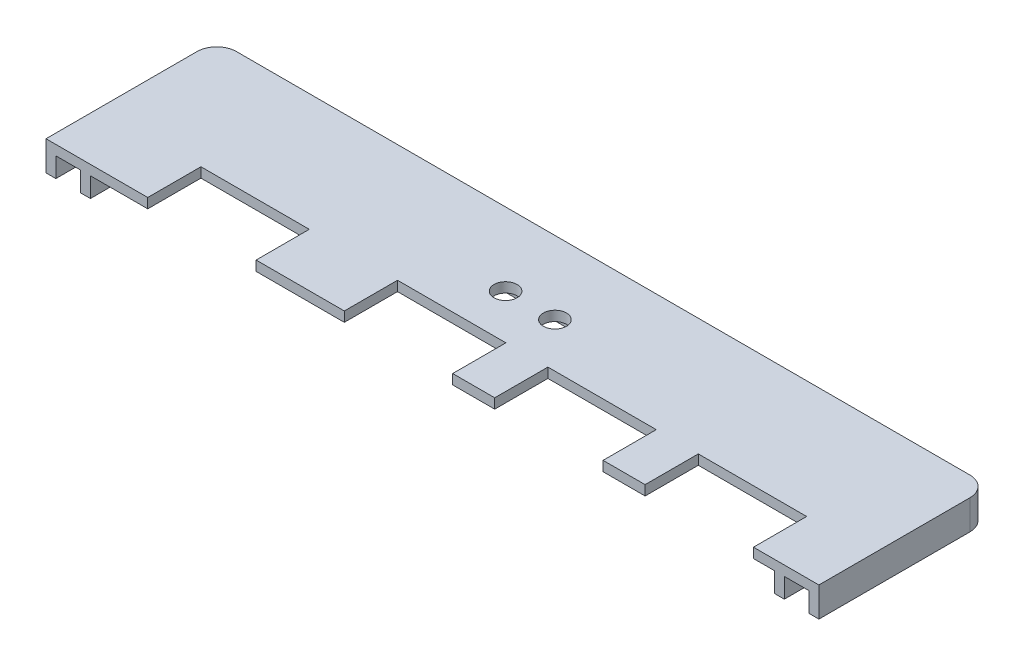
ISO-10303-21;
HEADER;
FILE_DESCRIPTION(('STEP AP214'),'2;1');
FILE_NAME('part.step','',(''),(''),'','','');
FILE_SCHEMA(('AUTOMOTIVE_DESIGN { 1 0 10303 214 1 1 1 1 }'));
ENDSEC;
DATA;
#1=APPLICATION_CONTEXT('core data for automotive mechanical design processes');
#2=APPLICATION_PROTOCOL_DEFINITION('international standard','automotive_design',2000,#1);
#3=PRODUCT_CONTEXT('',#1,'mechanical');
#4=PRODUCT('Part','Part','',(#3));
#5=PRODUCT_RELATED_PRODUCT_CATEGORY('part','',(#4));
#6=PRODUCT_DEFINITION_FORMATION('','',#4);
#7=PRODUCT_DEFINITION_CONTEXT('part definition',#1,'design');
#8=PRODUCT_DEFINITION('design','',#6,#7);
#9=PRODUCT_DEFINITION_SHAPE('','',#8);
#10=(LENGTH_UNIT() NAMED_UNIT(*) SI_UNIT(.MILLI.,.METRE.));
#11=(NAMED_UNIT(*) PLANE_ANGLE_UNIT() SI_UNIT($,.RADIAN.));
#12=(NAMED_UNIT(*) SI_UNIT($,.STERADIAN.) SOLID_ANGLE_UNIT());
#13=UNCERTAINTY_MEASURE_WITH_UNIT(LENGTH_MEASURE(1.E-05),#10,'distance_accuracy_value','');
#14=(GEOMETRIC_REPRESENTATION_CONTEXT(3) GLOBAL_UNCERTAINTY_ASSIGNED_CONTEXT((#13)) GLOBAL_UNIT_ASSIGNED_CONTEXT((#10,
#11,#12)) REPRESENTATION_CONTEXT('',''));
#15=CARTESIAN_POINT('',(0.,0.,0.));
#16=DIRECTION('',(0.,0.,1.));
#17=DIRECTION('',(1.,0.,0.));
#18=AXIS2_PLACEMENT_3D('',#15,#16,#17);
#19=CARTESIAN_POINT('',(0.,1.27,-22.9743000000001));
#20=DIRECTION('',(0.,0.,-1.));
#21=DIRECTION('',(-1.,0.,0.));
#22=AXIS2_PLACEMENT_3D('',#19,#20,#21);
#23=PLANE('',#22);
#24=DIRECTION('',(1.,0.,0.));
#25=VECTOR('',#24,1.);
#26=CARTESIAN_POINT('',(0.,0.,-22.9743000000001));
#27=LINE('',#26,#25);
#28=CARTESIAN_POINT('',(27.3685000000001,0.,-22.9743000000001));
#29=VERTEX_POINT('',#28);
#30=CARTESIAN_POINT('',(41.3131000000001,0.,-22.9743000000002));
#31=VERTEX_POINT('',#30);
#32=EDGE_CURVE('E368',#29,#31,#27,.T.);
#33=ORIENTED_EDGE('',*,*,#32,.T.);
#34=DIRECTION('',(0.,-1.,0.));
#35=VECTOR('',#34,1.);
#36=CARTESIAN_POINT('',(41.3131000000001,1.27,-22.9743000000002));
#37=LINE('',#36,#35);
#38=CARTESIAN_POINT('',(41.3131000000001,1.27,-22.9743000000002));
#39=VERTEX_POINT('',#38);
#40=EDGE_CURVE('E378',#39,#31,#37,.T.);
#41=ORIENTED_EDGE('',*,*,#40,.F.);
#42=DIRECTION('',(1.,0.,0.));
#43=VECTOR('',#42,1.);
#44=CARTESIAN_POINT('',(0.,1.27,-22.9743000000001));
#45=LINE('',#44,#43);
#46=CARTESIAN_POINT('',(27.3685000000001,1.27,-22.9743000000001));
#47=VERTEX_POINT('',#46);
#48=EDGE_CURVE('E334',#47,#39,#45,.T.);
#49=ORIENTED_EDGE('',*,*,#48,.F.);
#50=DIRECTION('',(0.,-1.,0.));
#51=VECTOR('',#50,1.);
#52=CARTESIAN_POINT('',(27.3685000000001,1.27,-22.9743000000001));
#53=LINE('',#52,#51);
#54=EDGE_CURVE('E376',#47,#29,#53,.T.);
#55=ORIENTED_EDGE('',*,*,#54,.T.);
#56=EDGE_LOOP('',(#33,#41,#49,#55));
#57=FACE_BOUND('',#56,.T.);
#58=ADVANCED_FACE('F34',(#57),#23,.F.);
#59=CARTESIAN_POINT('',(0.,1.27,-22.9743000000002));
#60=DIRECTION('',(0.,0.,-1.));
#61=DIRECTION('',(-1.,0.,0.));
#62=AXIS2_PLACEMENT_3D('',#59,#60,#61);
#63=PLANE('',#62);
#64=DIRECTION('',(1.,0.,0.));
#65=VECTOR('',#64,1.);
#66=CARTESIAN_POINT('',(0.,0.,-22.9743000000002));
#67=LINE('',#66,#65);
#68=CARTESIAN_POINT('',(8.0137,0.,-22.9743000000002));
#69=VERTEX_POINT('',#68);
#70=CARTESIAN_POINT('',(21.9583000000001,0.,-22.9743000000001));
#71=VERTEX_POINT('',#70);
#72=EDGE_CURVE('E359',#69,#71,#67,.T.);
#73=ORIENTED_EDGE('',*,*,#72,.T.);
#74=DIRECTION('',(0.,-1.,0.));
#75=VECTOR('',#74,1.);
#76=CARTESIAN_POINT('',(21.9583000000001,1.27,-22.9743000000001));
#77=LINE('',#76,#75);
#78=CARTESIAN_POINT('',(21.9583000000001,1.27,-22.9743000000001));
#79=VERTEX_POINT('',#78);
#80=EDGE_CURVE('E379',#79,#71,#77,.T.);
#81=ORIENTED_EDGE('',*,*,#80,.F.);
#82=DIRECTION('',(1.,0.,0.));
#83=VECTOR('',#82,1.);
#84=CARTESIAN_POINT('',(0.,1.27,-22.9743000000002));
#85=LINE('',#84,#83);
#86=CARTESIAN_POINT('',(8.0137,1.27,-22.9743000000002));
#87=VERTEX_POINT('',#86);
#88=EDGE_CURVE('E325',#87,#79,#85,.T.);
#89=ORIENTED_EDGE('',*,*,#88,.F.);
#90=DIRECTION('',(0.,-1.,0.));
#91=VECTOR('',#90,1.);
#92=CARTESIAN_POINT('',(8.0137,1.27,-22.9743000000002));
#93=LINE('',#92,#91);
#94=EDGE_CURVE('E383',#87,#69,#93,.T.);
#95=ORIENTED_EDGE('',*,*,#94,.T.);
#96=EDGE_LOOP('',(#73,#81,#89,#95));
#97=FACE_BOUND('',#96,.T.);
#98=ADVANCED_FACE('F601',(#97),#63,.F.);
#99=CARTESIAN_POINT('',(0.,1.27,-22.9743000000001));
#100=DIRECTION('',(0.,0.,-1.));
#101=DIRECTION('',(-1.,0.,0.));
#102=AXIS2_PLACEMENT_3D('',#99,#100,#101);
#103=PLANE('',#102);
#104=DIRECTION('',(1.,0.,0.));
#105=VECTOR('',#104,1.);
#106=CARTESIAN_POINT('',(0.,0.,-22.9743000000001));
#107=LINE('',#106,#105);
#108=CARTESIAN_POINT('',(-11.3411,0.,-22.9743000000001));
#109=VERTEX_POINT('',#108);
#110=CARTESIAN_POINT('',(2.60350000000002,0.,-22.9743000000001));
#111=VERTEX_POINT('',#110);
#112=EDGE_CURVE('E350',#109,#111,#107,.T.);
#113=ORIENTED_EDGE('',*,*,#112,.T.);
#114=DIRECTION('',(0.,-1.,0.));
#115=VECTOR('',#114,1.);
#116=CARTESIAN_POINT('',(2.60350000000002,1.27,-22.9743000000001));
#117=LINE('',#116,#115);
#118=CARTESIAN_POINT('',(2.60350000000002,1.27,-22.9743000000001));
#119=VERTEX_POINT('',#118);
#120=EDGE_CURVE('E385',#119,#111,#117,.T.);
#121=ORIENTED_EDGE('',*,*,#120,.F.);
#122=DIRECTION('',(1.,0.,0.));
#123=VECTOR('',#122,1.);
#124=CARTESIAN_POINT('',(0.,1.27,-22.9743000000001));
#125=LINE('',#124,#123);
#126=CARTESIAN_POINT('',(-11.3411,1.27,-22.9743000000001));
#127=VERTEX_POINT('',#126);
#128=EDGE_CURVE('E316',#127,#119,#125,.T.);
#129=ORIENTED_EDGE('',*,*,#128,.F.);
#130=DIRECTION('',(0.,-1.,0.));
#131=VECTOR('',#130,1.);
#132=CARTESIAN_POINT('',(-11.3411,1.27,-22.9743000000001));
#133=LINE('',#132,#131);
#134=EDGE_CURVE('E388',#127,#109,#133,.T.);
#135=ORIENTED_EDGE('',*,*,#134,.T.);
#136=EDGE_LOOP('',(#113,#121,#129,#135));
#137=FACE_BOUND('',#136,.T.);
#138=ADVANCED_FACE('F588',(#137),#103,.F.);
#139=CARTESIAN_POINT('',(0.,1.27,-22.9743000000001));
#140=DIRECTION('',(0.,0.,-1.));
#141=DIRECTION('',(-1.,0.,0.));
#142=AXIS2_PLACEMENT_3D('',#139,#140,#141);
#143=PLANE('',#142);
#144=DIRECTION('',(1.,0.,0.));
#145=VECTOR('',#144,1.);
#146=CARTESIAN_POINT('',(0.,0.,-22.9743000000001));
#147=LINE('',#146,#145);
#148=CARTESIAN_POINT('',(-36.6395,0.,-22.9743000000001));
#149=VERTEX_POINT('',#148);
#150=CARTESIAN_POINT('',(-22.6949,0.,-22.9743000000001));
#151=VERTEX_POINT('',#150);
#152=EDGE_CURVE('E347',#149,#151,#147,.T.);
#153=ORIENTED_EDGE('',*,*,#152,.T.);
#154=DIRECTION('',(0.,-1.,0.));
#155=VECTOR('',#154,1.);
#156=CARTESIAN_POINT('',(-22.6949,1.27,-22.9743000000001));
#157=LINE('',#156,#155);
#158=CARTESIAN_POINT('',(-22.6949,1.27,-22.9743000000001));
#159=VERTEX_POINT('',#158);
#160=EDGE_CURVE('E343',#159,#151,#157,.T.);
#161=ORIENTED_EDGE('',*,*,#160,.F.);
#162=DIRECTION('',(1.,0.,0.));
#163=VECTOR('',#162,1.);
#164=CARTESIAN_POINT('',(0.,1.27,-22.9743000000001));
#165=LINE('',#164,#163);
#166=CARTESIAN_POINT('',(-36.6395,1.27,-22.9743000000001));
#167=VERTEX_POINT('',#166);
#168=EDGE_CURVE('E307',#167,#159,#165,.T.);
#169=ORIENTED_EDGE('',*,*,#168,.F.);
#170=DIRECTION('',(0.,-1.,0.));
#171=VECTOR('',#170,1.);
#172=CARTESIAN_POINT('',(-36.6395,1.27,-22.9743000000001));
#173=LINE('',#172,#171);
#174=EDGE_CURVE('E390',#167,#149,#173,.T.);
#175=ORIENTED_EDGE('',*,*,#174,.T.);
#176=EDGE_LOOP('',(#153,#161,#169,#175));
#177=FACE_BOUND('',#176,.T.);
#178=ADVANCED_FACE('F637',(#177),#143,.F.);
#179=CARTESIAN_POINT('',(47.1932000000001,1.27,-35.56));
#180=DIRECTION('',(0.,1.,0.));
#181=DIRECTION('',(0.,0.,1.));
#182=AXIS2_PLACEMENT_3D('',#179,#180,#181);
#183=CYLINDRICAL_SURFACE('',#182,2.54);
#184=CARTESIAN_POINT('',(47.1932000000001,1.27,-35.56));
#185=DIRECTION('',(0.,1.,0.));
#186=DIRECTION('',(0.,0.,1.));
#187=AXIS2_PLACEMENT_3D('',#184,#185,#186);
#188=CIRCLE('',#187,2.54);
#189=CARTESIAN_POINT('',(49.7332000000001,1.27,-35.56));
#190=VERTEX_POINT('',#189);
#191=CARTESIAN_POINT('',(47.1932000000001,1.27,-38.1));
#192=VERTEX_POINT('',#191);
#193=EDGE_CURVE('E403',#190,#192,#188,.T.);
#194=ORIENTED_EDGE('',*,*,#193,.F.);
#195=DIRECTION('',(0.,-1.,0.));
#196=VECTOR('',#195,1.);
#197=CARTESIAN_POINT('',(49.7332000000001,1.27,-35.56));
#198=LINE('',#197,#196);
#199=CARTESIAN_POINT('',(49.7332000000001,-2.54,-35.56));
#200=VERTEX_POINT('',#199);
#201=EDGE_CURVE('E407',#200,#190,#198,.F.);
#202=ORIENTED_EDGE('',*,*,#201,.F.);
#203=CARTESIAN_POINT('',(47.1932000000001,-2.54,-35.56));
#204=DIRECTION('',(0.,-1.,0.));
#205=DIRECTION('',(0.,0.,-1.));
#206=AXIS2_PLACEMENT_3D('',#203,#204,#205);
#207=CIRCLE('',#206,2.54);
#208=CARTESIAN_POINT('',(47.1932000000001,-2.54,-38.1));
#209=VERTEX_POINT('',#208);
#210=EDGE_CURVE('E280',#209,#200,#207,.T.);
#211=ORIENTED_EDGE('',*,*,#210,.F.);
#212=DIRECTION('',(0.,-1.,0.));
#213=VECTOR('',#212,1.);
#214=CARTESIAN_POINT('',(47.1932000000001,0.,-38.1));
#215=LINE('',#214,#213);
#216=EDGE_CURVE('E399',#192,#209,#215,.T.);
#217=ORIENTED_EDGE('',*,*,#216,.F.);
#218=EDGE_LOOP('',(#194,#202,#211,#217));
#219=FACE_BOUND('',#218,.T.);
#220=ADVANCED_FACE('F36',(#219),#183,.T.);
#221=CARTESIAN_POINT('',(0.,1.27,-38.1));
#222=DIRECTION('',(0.,0.,-1.));
#223=DIRECTION('',(-1.,0.,0.));
#224=AXIS2_PLACEMENT_3D('',#221,#222,#223);
#225=PLANE('',#224);
#226=ORIENTED_EDGE('',*,*,#216,.T.);
#227=DIRECTION('',(1.,0.,0.));
#228=VECTOR('',#227,1.);
#229=CARTESIAN_POINT('',(0.,-2.54,-38.1));
#230=LINE('',#229,#228);
#231=CARTESIAN_POINT('',(-47.1932,-2.54,-38.1));
#232=VERTEX_POINT('',#231);
#233=EDGE_CURVE('E286',#232,#209,#230,.T.);
#234=ORIENTED_EDGE('',*,*,#233,.F.);
#235=DIRECTION('',(0.,-1.,0.));
#236=VECTOR('',#235,1.);
#237=CARTESIAN_POINT('',(-47.1932,1.27,-38.1));
#238=LINE('',#237,#236);
#239=CARTESIAN_POINT('',(-47.1932,1.27,-38.1));
#240=VERTEX_POINT('',#239);
#241=EDGE_CURVE('E401',#232,#240,#238,.F.);
#242=ORIENTED_EDGE('',*,*,#241,.T.);
#243=DIRECTION('',(1.,0.,0.));
#244=VECTOR('',#243,1.);
#245=CARTESIAN_POINT('',(0.,1.27,-38.1));
#246=LINE('',#245,#244);
#247=EDGE_CURVE('E311',#240,#192,#246,.T.);
#248=ORIENTED_EDGE('',*,*,#247,.T.);
#249=EDGE_LOOP('',(#226,#234,#242,#248));
#250=FACE_BOUND('',#249,.T.);
#251=ADVANCED_FACE('F484',(#250),#225,.T.);
#252=CARTESIAN_POINT('',(-47.1932,1.27,-35.56));
#253=DIRECTION('',(0.,-1.,0.));
#254=DIRECTION('',(0.,0.,-1.));
#255=AXIS2_PLACEMENT_3D('',#252,#253,#254);
#256=CYLINDRICAL_SURFACE('',#255,2.54);
#257=CARTESIAN_POINT('',(-47.1932,1.27,-35.56));
#258=DIRECTION('',(0.,1.,0.));
#259=DIRECTION('',(0.,0.,1.));
#260=AXIS2_PLACEMENT_3D('',#257,#258,#259);
#261=CIRCLE('',#260,2.54);
#262=CARTESIAN_POINT('',(-49.7332,1.27,-35.56));
#263=VERTEX_POINT('',#262);
#264=EDGE_CURVE('E405',#240,#263,#261,.T.);
#265=ORIENTED_EDGE('',*,*,#264,.F.);
#266=ORIENTED_EDGE('',*,*,#241,.F.);
#267=CARTESIAN_POINT('',(-47.1932,-2.54,-35.56));
#268=DIRECTION('',(0.,-1.,0.));
#269=DIRECTION('',(0.,0.,-1.));
#270=AXIS2_PLACEMENT_3D('',#267,#268,#269);
#271=CIRCLE('',#270,2.54);
#272=CARTESIAN_POINT('',(-49.7332,-2.54,-35.56));
#273=VERTEX_POINT('',#272);
#274=EDGE_CURVE('E472',#273,#232,#271,.T.);
#275=ORIENTED_EDGE('',*,*,#274,.F.);
#276=DIRECTION('',(0.,-1.,0.));
#277=VECTOR('',#276,1.);
#278=CARTESIAN_POINT('',(-49.7332,1.27,-35.56));
#279=LINE('',#278,#277);
#280=EDGE_CURVE('E382',#263,#273,#279,.T.);
#281=ORIENTED_EDGE('',*,*,#280,.F.);
#282=EDGE_LOOP('',(#265,#266,#275,#281));
#283=FACE_BOUND('',#282,.T.);
#284=ADVANCED_FACE('F486',(#283),#256,.T.);
#285=CARTESIAN_POINT('',(0.,-2.54,-36.83));
#286=DIRECTION('',(0.,0.,-1.));
#287=DIRECTION('',(-1.,0.,0.));
#288=AXIS2_PLACEMENT_3D('',#285,#286,#287);
#289=PLANE('',#288);
#290=DIRECTION('',(-1.,0.,0.));
#291=VECTOR('',#290,1.);
#292=CARTESIAN_POINT('',(0.,0.,-36.83));
#293=LINE('',#292,#291);
#294=CARTESIAN_POINT('',(48.4632,0.,-36.83));
#295=VERTEX_POINT('',#294);
#296=CARTESIAN_POINT('',(-48.4632,0.,-36.83));
#297=VERTEX_POINT('',#296);
#298=EDGE_CURVE('E292',#295,#297,#293,.T.);
#299=ORIENTED_EDGE('',*,*,#298,.T.);
#300=DIRECTION('',(0.,1.,0.));
#301=VECTOR('',#300,1.);
#302=CARTESIAN_POINT('',(-48.4632,-2.54,-36.83));
#303=LINE('',#302,#301);
#304=CARTESIAN_POINT('',(-48.4632,-2.54,-36.83));
#305=VERTEX_POINT('',#304);
#306=EDGE_CURVE('E281',#305,#297,#303,.T.);
#307=ORIENTED_EDGE('',*,*,#306,.F.);
#308=DIRECTION('',(-1.,0.,0.));
#309=VECTOR('',#308,1.);
#310=CARTESIAN_POINT('',(0.,-2.54,-36.83));
#311=LINE('',#310,#309);
#312=CARTESIAN_POINT('',(48.4632,-2.54,-36.83));
#313=VERTEX_POINT('',#312);
#314=EDGE_CURVE('E465',#313,#305,#311,.T.);
#315=ORIENTED_EDGE('',*,*,#314,.F.);
#316=DIRECTION('',(0.,1.,0.));
#317=VECTOR('',#316,1.);
#318=CARTESIAN_POINT('',(48.4632,-2.54,-36.83));
#319=LINE('',#318,#317);
#320=EDGE_CURVE('E284',#313,#295,#319,.T.);
#321=ORIENTED_EDGE('',*,*,#320,.T.);
#322=EDGE_LOOP('',(#299,#307,#315,#321));
#323=FACE_BOUND('',#322,.T.);
#324=ADVANCED_FACE('F653',(#323),#289,.F.);
#325=CARTESIAN_POINT('',(0.,-2.54,-33.655));
#326=DIRECTION('',(0.,0.,-1.));
#327=DIRECTION('',(-1.,0.,0.));
#328=AXIS2_PLACEMENT_3D('',#325,#326,#327);
#329=PLANE('',#328);
#330=DIRECTION('',(-1.,0.,0.));
#331=VECTOR('',#330,1.);
#332=CARTESIAN_POINT('',(0.,0.,-33.655));
#333=LINE('',#332,#331);
#334=CARTESIAN_POINT('',(45.2882,0.,-33.655));
#335=VERTEX_POINT('',#334);
#336=CARTESIAN_POINT('',(-45.2882,0.,-33.655));
#337=VERTEX_POINT('',#336);
#338=EDGE_CURVE('E450',#335,#337,#333,.T.);
#339=ORIENTED_EDGE('',*,*,#338,.F.);
#340=DIRECTION('',(0.,1.,0.));
#341=VECTOR('',#340,1.);
#342=CARTESIAN_POINT('',(45.2882,-2.54,-33.655));
#343=LINE('',#342,#341);
#344=CARTESIAN_POINT('',(45.2882,-2.54,-33.655));
#345=VERTEX_POINT('',#344);
#346=EDGE_CURVE('E455',#345,#335,#343,.T.);
#347=ORIENTED_EDGE('',*,*,#346,.F.);
#348=DIRECTION('',(-1.,0.,0.));
#349=VECTOR('',#348,1.);
#350=CARTESIAN_POINT('',(0.,-2.54,-33.655));
#351=LINE('',#350,#349);
#352=CARTESIAN_POINT('',(-45.2882,-2.54,-33.655));
#353=VERTEX_POINT('',#352);
#354=EDGE_CURVE('E429',#345,#353,#351,.T.);
#355=ORIENTED_EDGE('',*,*,#354,.T.);
#356=DIRECTION('',(0.,1.,0.));
#357=VECTOR('',#356,1.);
#358=CARTESIAN_POINT('',(-45.2882,-2.54,-33.655));
#359=LINE('',#358,#357);
#360=EDGE_CURVE('E293',#353,#337,#359,.T.);
#361=ORIENTED_EDGE('',*,*,#360,.T.);
#362=EDGE_LOOP('',(#339,#347,#355,#361));
#363=FACE_BOUND('',#362,.T.);
#364=ADVANCED_FACE('F657',(#363),#329,.T.);
#365=CARTESIAN_POINT('',(0.,-2.54,-32.385));
#366=DIRECTION('',(0.,0.,-1.));
#367=DIRECTION('',(-1.,0.,0.));
#368=AXIS2_PLACEMENT_3D('',#365,#366,#367);
#369=PLANE('',#368);
#370=DIRECTION('',(-1.,0.,0.));
#371=VECTOR('',#370,1.);
#372=CARTESIAN_POINT('',(0.,0.,-32.385));
#373=LINE('',#372,#371);
#374=CARTESIAN_POINT('',(44.0182,0.,-32.385));
#375=VERTEX_POINT('',#374);
#376=CARTESIAN_POINT('',(-44.0182,0.,-32.385));
#377=VERTEX_POINT('',#376);
#378=EDGE_CURVE('E445',#375,#377,#373,.T.);
#379=ORIENTED_EDGE('',*,*,#378,.T.);
#380=DIRECTION('',(0.,1.,0.));
#381=VECTOR('',#380,1.);
#382=CARTESIAN_POINT('',(-44.0182,-2.54,-32.385));
#383=LINE('',#382,#381);
#384=CARTESIAN_POINT('',(-44.0182,-2.54,-32.385));
#385=VERTEX_POINT('',#384);
#386=EDGE_CURVE('E439',#385,#377,#383,.T.);
#387=ORIENTED_EDGE('',*,*,#386,.F.);
#388=DIRECTION('',(-1.,0.,0.));
#389=VECTOR('',#388,1.);
#390=CARTESIAN_POINT('',(0.,-2.54,-32.385));
#391=LINE('',#390,#389);
#392=CARTESIAN_POINT('',(44.0182,-2.54,-32.385));
#393=VERTEX_POINT('',#392);
#394=EDGE_CURVE('E430',#393,#385,#391,.T.);
#395=ORIENTED_EDGE('',*,*,#394,.F.);
#396=DIRECTION('',(0.,1.,0.));
#397=VECTOR('',#396,1.);
#398=CARTESIAN_POINT('',(44.0182,-2.54,-32.385));
#399=LINE('',#398,#397);
#400=EDGE_CURVE('E458',#393,#375,#399,.T.);
#401=ORIENTED_EDGE('',*,*,#400,.T.);
#402=EDGE_LOOP('',(#379,#387,#395,#401));
#403=FACE_BOUND('',#402,.T.);
#404=ADVANCED_FACE('F544',(#403),#369,.F.);
#405=CARTESIAN_POINT('',(0.,-2.54,0.));
#406=DIRECTION('',(0.,-1.,0.));
#407=DIRECTION('',(0.,0.,-1.));
#408=AXIS2_PLACEMENT_3D('',#405,#406,#407);
#409=PLANE('',#408);
#410=DIRECTION('',(0.,0.,-1.));
#411=VECTOR('',#410,1.);
#412=CARTESIAN_POINT('',(45.2882,-2.54,0.));
#413=LINE('',#412,#411);
#414=CARTESIAN_POINT('',(45.2882,-2.54,-16.1290000000001));
#415=VERTEX_POINT('',#414);
#416=EDGE_CURVE('E432',#415,#345,#413,.T.);
#417=ORIENTED_EDGE('',*,*,#416,.F.);
#418=DIRECTION('',(-1.,0.,0.));
#419=VECTOR('',#418,1.);
#420=CARTESIAN_POINT('',(0.,-2.54,-16.1290000000001));
#421=LINE('',#420,#419);
#422=CARTESIAN_POINT('',(44.0182,-2.54,-16.1290000000001));
#423=VERTEX_POINT('',#422);
#424=EDGE_CURVE('E11',#415,#423,#421,.T.);
#425=ORIENTED_EDGE('',*,*,#424,.T.);
#426=DIRECTION('',(0.,0.,-1.));
#427=VECTOR('',#426,1.);
#428=CARTESIAN_POINT('',(44.0182,-2.54,0.));
#429=LINE('',#428,#427);
#430=EDGE_CURVE('E434',#423,#393,#429,.T.);
#431=ORIENTED_EDGE('',*,*,#430,.T.);
#432=ORIENTED_EDGE('',*,*,#394,.T.);
#433=DIRECTION('',(0.,0.,-1.));
#434=VECTOR('',#433,1.);
#435=CARTESIAN_POINT('',(-44.0182,-2.54,0.));
#436=LINE('',#435,#434);
#437=CARTESIAN_POINT('',(-44.0182,-2.54,-16.1290000000001));
#438=VERTEX_POINT('',#437);
#439=EDGE_CURVE('E419',#438,#385,#436,.T.);
#440=ORIENTED_EDGE('',*,*,#439,.F.);
#441=CARTESIAN_POINT('',(-45.2882,-2.54,-16.1290000000001));
#442=VERTEX_POINT('',#441);
#443=EDGE_CURVE('E38',#438,#442,#421,.T.);
#444=ORIENTED_EDGE('',*,*,#443,.T.);
#445=DIRECTION('',(0.,0.,-1.));
#446=VECTOR('',#445,1.);
#447=CARTESIAN_POINT('',(-45.2882,-2.54,0.));
#448=LINE('',#447,#446);
#449=EDGE_CURVE('E416',#442,#353,#448,.T.);
#450=ORIENTED_EDGE('',*,*,#449,.T.);
#451=ORIENTED_EDGE('',*,*,#354,.F.);
#452=EDGE_LOOP('',(#417,#425,#431,#432,#440,#444,#450,#451));
#453=FACE_BOUND('',#452,.T.);
#454=ADVANCED_FACE('F414',(#453),#409,.T.);
#455=CARTESIAN_POINT('',(45.2882,-2.54,0.));
#456=DIRECTION('',(1.,0.,0.));
#457=DIRECTION('',(0.,0.,-1.));
#458=AXIS2_PLACEMENT_3D('',#455,#456,#457);
#459=PLANE('',#458);
#460=DIRECTION('',(0.,0.,-1.));
#461=VECTOR('',#460,1.);
#462=CARTESIAN_POINT('',(45.2882,0.,0.));
#463=LINE('',#462,#461);
#464=CARTESIAN_POINT('',(45.2882,0.,-16.1290000000001));
#465=VERTEX_POINT('',#464);
#466=EDGE_CURVE('E453',#465,#335,#463,.T.);
#467=ORIENTED_EDGE('',*,*,#466,.F.);
#468=DIRECTION('',(0.,-1.,0.));
#469=VECTOR('',#468,1.);
#470=CARTESIAN_POINT('',(45.2882,-2.54,-16.1290000000001));
#471=LINE('',#470,#469);
#472=EDGE_CURVE('E495',#465,#415,#471,.T.);
#473=ORIENTED_EDGE('',*,*,#472,.T.);
#474=ORIENTED_EDGE('',*,*,#416,.T.);
#475=ORIENTED_EDGE('',*,*,#346,.T.);
#476=EDGE_LOOP('',(#467,#473,#474,#475));
#477=FACE_BOUND('',#476,.T.);
#478=ADVANCED_FACE('F706',(#477),#459,.T.);
#479=CARTESIAN_POINT('',(44.0182,-2.54,0.));
#480=DIRECTION('',(1.,0.,0.));
#481=DIRECTION('',(0.,0.,-1.));
#482=AXIS2_PLACEMENT_3D('',#479,#480,#481);
#483=PLANE('',#482);
#484=DIRECTION('',(0.,-1.,0.));
#485=VECTOR('',#484,1.);
#486=CARTESIAN_POINT('',(44.0182,-2.54,-16.1290000000001));
#487=LINE('',#486,#485);
#488=CARTESIAN_POINT('',(44.0182,0.,-16.1290000000001));
#489=VERTEX_POINT('',#488);
#490=EDGE_CURVE('E505',#489,#423,#487,.T.);
#491=ORIENTED_EDGE('',*,*,#490,.F.);
#492=DIRECTION('',(0.,0.,-1.));
#493=VECTOR('',#492,1.);
#494=CARTESIAN_POINT('',(44.0182,0.,0.));
#495=LINE('',#494,#493);
#496=EDGE_CURVE('E442',#489,#375,#495,.T.);
#497=ORIENTED_EDGE('',*,*,#496,.T.);
#498=ORIENTED_EDGE('',*,*,#400,.F.);
#499=ORIENTED_EDGE('',*,*,#430,.F.);
#500=EDGE_LOOP('',(#491,#497,#498,#499));
#501=FACE_BOUND('',#500,.T.);
#502=ADVANCED_FACE('F540',(#501),#483,.F.);
#503=CARTESIAN_POINT('',(-44.0182,-2.54,0.));
#504=DIRECTION('',(1.,0.,0.));
#505=DIRECTION('',(0.,0.,-1.));
#506=AXIS2_PLACEMENT_3D('',#503,#504,#505);
#507=PLANE('',#506);
#508=DIRECTION('',(0.,0.,-1.));
#509=VECTOR('',#508,1.);
#510=CARTESIAN_POINT('',(-44.0182,0.,0.));
#511=LINE('',#510,#509);
#512=CARTESIAN_POINT('',(-44.0182,0.,-16.1290000000001));
#513=VERTEX_POINT('',#512);
#514=EDGE_CURVE('E440',#513,#377,#511,.T.);
#515=ORIENTED_EDGE('',*,*,#514,.F.);
#516=DIRECTION('',(0.,-1.,0.));
#517=VECTOR('',#516,1.);
#518=CARTESIAN_POINT('',(-44.0182,-2.54,-16.1290000000001));
#519=LINE('',#518,#517);
#520=EDGE_CURVE('E513',#513,#438,#519,.T.);
#521=ORIENTED_EDGE('',*,*,#520,.T.);
#522=ORIENTED_EDGE('',*,*,#439,.T.);
#523=ORIENTED_EDGE('',*,*,#386,.T.);
#524=EDGE_LOOP('',(#515,#521,#522,#523));
#525=FACE_BOUND('',#524,.T.);
#526=ADVANCED_FACE('F547',(#525),#507,.T.);
#527=CARTESIAN_POINT('',(-45.2882,-2.54,0.));
#528=DIRECTION('',(1.,0.,0.));
#529=DIRECTION('',(0.,0.,-1.));
#530=AXIS2_PLACEMENT_3D('',#527,#528,#529);
#531=PLANE('',#530);
#532=DIRECTION('',(0.,-1.,0.));
#533=VECTOR('',#532,1.);
#534=CARTESIAN_POINT('',(-45.2882,-2.54,-16.1290000000001));
#535=LINE('',#534,#533);
#536=CARTESIAN_POINT('',(-45.2882,0.,-16.1290000000001));
#537=VERTEX_POINT('',#536);
#538=EDGE_CURVE('E425',#537,#442,#535,.T.);
#539=ORIENTED_EDGE('',*,*,#538,.F.);
#540=DIRECTION('',(0.,0.,-1.));
#541=VECTOR('',#540,1.);
#542=CARTESIAN_POINT('',(-45.2882,0.,0.));
#543=LINE('',#542,#541);
#544=EDGE_CURVE('E448',#537,#337,#543,.T.);
#545=ORIENTED_EDGE('',*,*,#544,.T.);
#546=ORIENTED_EDGE('',*,*,#360,.F.);
#547=ORIENTED_EDGE('',*,*,#449,.F.);
#548=EDGE_LOOP('',(#539,#545,#546,#547));
#549=FACE_BOUND('',#548,.T.);
#550=ADVANCED_FACE('F424',(#549),#531,.F.);
#551=CARTESIAN_POINT('',(0.,1.27,0.));
#552=DIRECTION('',(0.,1.,0.));
#553=DIRECTION('',(0.,0.,1.));
#554=AXIS2_PLACEMENT_3D('',#551,#552,#553);
#555=PLANE('',#554);
#556=CARTESIAN_POINT('',(3.175,1.27,-28.7147000000001));
#557=DIRECTION('',(0.,1.,0.));
#558=DIRECTION('',(0.,0.,1.));
#559=AXIS2_PLACEMENT_3D('',#556,#557,#558);
#560=CIRCLE('',#559,1.4859);
#561=CARTESIAN_POINT('',(3.175,1.27,-27.2288000000001));
#562=VERTEX_POINT('',#561);
#563=EDGE_CURVE('E733',#562,#562,#560,.F.);
#564=ORIENTED_EDGE('',*,*,#563,.T.);
#565=EDGE_LOOP('',(#564));
#566=FACE_BOUND('',#565,.T.);
#567=CARTESIAN_POINT('',(-3.175,1.27,-28.7147000000001));
#568=DIRECTION('',(0.,1.,0.));
#569=DIRECTION('',(0.,0.,1.));
#570=AXIS2_PLACEMENT_3D('',#567,#568,#569);
#571=CIRCLE('',#570,1.4859);
#572=CARTESIAN_POINT('',(-3.175,1.27,-27.2288000000001));
#573=VERTEX_POINT('',#572);
#574=EDGE_CURVE('E576',#573,#573,#571,.F.);
#575=ORIENTED_EDGE('',*,*,#574,.T.);
#576=EDGE_LOOP('',(#575));
#577=FACE_BOUND('',#576,.T.);
#578=DIRECTION('',(0.,0.,-1.));
#579=VECTOR('',#578,1.);
#580=CARTESIAN_POINT('',(-49.7332,1.27,0.));
#581=LINE('',#580,#579);
#582=CARTESIAN_POINT('',(-49.7332,1.27,-16.1290000000001));
#583=VERTEX_POINT('',#582);
#584=EDGE_CURVE('E314',#583,#263,#581,.T.);
#585=ORIENTED_EDGE('',*,*,#584,.F.);
#586=DIRECTION('',(1.,0.,0.));
#587=VECTOR('',#586,1.);
#588=CARTESIAN_POINT('',(-49.7332,1.27,-16.1290000000001));
#589=LINE('',#588,#587);
#590=CARTESIAN_POINT('',(-36.6395,1.27,-16.1290000000001));
#591=VERTEX_POINT('',#590);
#592=EDGE_CURVE('E265',#583,#591,#589,.T.);
#593=ORIENTED_EDGE('',*,*,#592,.T.);
#594=DIRECTION('',(0.,0.,-1.));
#595=VECTOR('',#594,1.);
#596=CARTESIAN_POINT('',(-36.6395,1.27,0.));
#597=LINE('',#596,#595);
#598=EDGE_CURVE('E304',#591,#167,#597,.T.);
#599=ORIENTED_EDGE('',*,*,#598,.T.);
#600=ORIENTED_EDGE('',*,*,#168,.T.);
#601=DIRECTION('',(0.,0.,-1.));
#602=VECTOR('',#601,1.);
#603=CARTESIAN_POINT('',(-22.6949,1.27,0.));
#604=LINE('',#603,#602);
#605=CARTESIAN_POINT('',(-22.6949,1.27,-16.1290000000001));
#606=VERTEX_POINT('',#605);
#607=EDGE_CURVE('E302',#606,#159,#604,.T.);
#608=ORIENTED_EDGE('',*,*,#607,.F.);
#609=CARTESIAN_POINT('',(-11.3411,1.27,-16.1290000000001));
#610=VERTEX_POINT('',#609);
#611=EDGE_CURVE('E573',#606,#610,#589,.T.);
#612=ORIENTED_EDGE('',*,*,#611,.T.);
#613=DIRECTION('',(0.,0.,1.));
#614=VECTOR('',#613,1.);
#615=CARTESIAN_POINT('',(-11.3411,1.27,0.));
#616=LINE('',#615,#614);
#617=EDGE_CURVE('E322',#127,#610,#616,.T.);
#618=ORIENTED_EDGE('',*,*,#617,.F.);
#619=ORIENTED_EDGE('',*,*,#128,.T.);
#620=DIRECTION('',(0.,0.,1.));
#621=VECTOR('',#620,1.);
#622=CARTESIAN_POINT('',(2.60350000000001,1.27,0.));
#623=LINE('',#622,#621);
#624=CARTESIAN_POINT('',(2.60350000000002,1.27,-16.1290000000001));
#625=VERTEX_POINT('',#624);
#626=EDGE_CURVE('E319',#119,#625,#623,.T.);
#627=ORIENTED_EDGE('',*,*,#626,.T.);
#628=CARTESIAN_POINT('',(8.01370000000003,1.27,-16.1290000000001));
#629=VERTEX_POINT('',#628);
#630=EDGE_CURVE('E571',#625,#629,#589,.T.);
#631=ORIENTED_EDGE('',*,*,#630,.T.);
#632=DIRECTION('',(0.,0.,1.));
#633=VECTOR('',#632,1.);
#634=CARTESIAN_POINT('',(8.01370000000009,1.27,0.));
#635=LINE('',#634,#633);
#636=EDGE_CURVE('E331',#87,#629,#635,.T.);
#637=ORIENTED_EDGE('',*,*,#636,.F.);
#638=ORIENTED_EDGE('',*,*,#88,.T.);
#639=DIRECTION('',(0.,0.,1.));
#640=VECTOR('',#639,1.);
#641=CARTESIAN_POINT('',(21.9583000000001,1.27,0.));
#642=LINE('',#641,#640);
#643=CARTESIAN_POINT('',(21.9583000000001,1.27,-16.1290000000001));
#644=VERTEX_POINT('',#643);
#645=EDGE_CURVE('E328',#79,#644,#642,.T.);
#646=ORIENTED_EDGE('',*,*,#645,.T.);
#647=CARTESIAN_POINT('',(27.3685000000001,1.27,-16.1290000000001));
#648=VERTEX_POINT('',#647);
#649=EDGE_CURVE('E570',#644,#648,#589,.T.);
#650=ORIENTED_EDGE('',*,*,#649,.T.);
#651=DIRECTION('',(0.,0.,1.));
#652=VECTOR('',#651,1.);
#653=CARTESIAN_POINT('',(27.3685000000001,1.27,0.));
#654=LINE('',#653,#652);
#655=EDGE_CURVE('E340',#47,#648,#654,.T.);
#656=ORIENTED_EDGE('',*,*,#655,.F.);
#657=ORIENTED_EDGE('',*,*,#48,.T.);
#658=DIRECTION('',(0.,0.,1.));
#659=VECTOR('',#658,1.);
#660=CARTESIAN_POINT('',(41.3131000000001,1.27,0.));
#661=LINE('',#660,#659);
#662=CARTESIAN_POINT('',(41.3131000000001,1.27,-16.1290000000001));
#663=VERTEX_POINT('',#662);
#664=EDGE_CURVE('E337',#39,#663,#661,.T.);
#665=ORIENTED_EDGE('',*,*,#664,.T.);
#666=CARTESIAN_POINT('',(49.7332000000001,1.27,-16.1290000000001));
#667=VERTEX_POINT('',#666);
#668=EDGE_CURVE('E572',#663,#667,#589,.T.);
#669=ORIENTED_EDGE('',*,*,#668,.T.);
#670=DIRECTION('',(0.,0.,-1.));
#671=VECTOR('',#670,1.);
#672=CARTESIAN_POINT('',(49.7332000000001,1.27,0.));
#673=LINE('',#672,#671);
#674=EDGE_CURVE('E273',#667,#190,#673,.T.);
#675=ORIENTED_EDGE('',*,*,#674,.T.);
#676=ORIENTED_EDGE('',*,*,#193,.T.);
#677=ORIENTED_EDGE('',*,*,#247,.F.);
#678=ORIENTED_EDGE('',*,*,#264,.T.);
#679=EDGE_LOOP('',(#585,#593,#599,#600,#608,#612,#618,#619,#627,#631,#637,#638,#646,#650,#656,
#657,#665,#669,#675,#676,#677,#678));
#680=FACE_BOUND('',#679,.T.);
#681=ADVANCED_FACE('F482',(#566,#577,#680),#555,.T.);
#682=CARTESIAN_POINT('',(0.,-2.54,0.));
#683=DIRECTION('',(0.,-1.,0.));
#684=DIRECTION('',(0.,0.,-1.));
#685=AXIS2_PLACEMENT_3D('',#682,#683,#684);
#686=PLANE('',#685);
#687=DIRECTION('',(0.,0.,1.));
#688=VECTOR('',#687,1.);
#689=CARTESIAN_POINT('',(49.7332000000001,-2.54,0.));
#690=LINE('',#689,#688);
#691=CARTESIAN_POINT('',(49.7332000000001,-2.54,-16.1290000000001));
#692=VERTEX_POINT('',#691);
#693=EDGE_CURVE('E272',#200,#692,#690,.T.);
#694=ORIENTED_EDGE('',*,*,#693,.T.);
#695=DIRECTION('',(1.,0.,0.));
#696=VECTOR('',#695,1.);
#697=CARTESIAN_POINT('',(-49.7332,-2.54,-16.1290000000001));
#698=LINE('',#697,#696);
#699=CARTESIAN_POINT('',(48.4632,-2.54,-16.1290000000001));
#700=VERTEX_POINT('',#699);
#701=EDGE_CURVE('E254',#700,#692,#698,.T.);
#702=ORIENTED_EDGE('',*,*,#701,.F.);
#703=DIRECTION('',(0.,0.,-1.));
#704=VECTOR('',#703,1.);
#705=CARTESIAN_POINT('',(48.4632,-2.54,0.));
#706=LINE('',#705,#704);
#707=EDGE_CURVE('E297',#700,#313,#706,.T.);
#708=ORIENTED_EDGE('',*,*,#707,.T.);
#709=ORIENTED_EDGE('',*,*,#314,.T.);
#710=DIRECTION('',(0.,0.,-1.));
#711=VECTOR('',#710,1.);
#712=CARTESIAN_POINT('',(-48.4632,-2.54,0.));
#713=LINE('',#712,#711);
#714=CARTESIAN_POINT('',(-48.4632,-2.54,-16.1290000000001));
#715=VERTEX_POINT('',#714);
#716=EDGE_CURVE('E468',#715,#305,#713,.T.);
#717=ORIENTED_EDGE('',*,*,#716,.F.);
#718=CARTESIAN_POINT('',(-49.7332,-2.54,-16.1290000000001));
#719=VERTEX_POINT('',#718);
#720=EDGE_CURVE('E264',#719,#715,#698,.T.);
#721=ORIENTED_EDGE('',*,*,#720,.F.);
#722=DIRECTION('',(0.,0.,-1.));
#723=VECTOR('',#722,1.);
#724=CARTESIAN_POINT('',(-49.7332,-2.54,0.));
#725=LINE('',#724,#723);
#726=EDGE_CURVE('E470',#719,#273,#725,.T.);
#727=ORIENTED_EDGE('',*,*,#726,.T.);
#728=ORIENTED_EDGE('',*,*,#274,.T.);
#729=ORIENTED_EDGE('',*,*,#233,.T.);
#730=ORIENTED_EDGE('',*,*,#210,.T.);
#731=EDGE_LOOP('',(#694,#702,#708,#709,#717,#721,#727,#728,#729,#730));
#732=FACE_BOUND('',#731,.T.);
#733=ADVANCED_FACE('F277',(#732),#686,.T.);
#734=CARTESIAN_POINT('',(-48.4632,-2.54,0.));
#735=DIRECTION('',(1.,0.,0.));
#736=DIRECTION('',(0.,0.,-1.));
#737=AXIS2_PLACEMENT_3D('',#734,#735,#736);
#738=PLANE('',#737);
#739=DIRECTION('',(0.,0.,-1.));
#740=VECTOR('',#739,1.);
#741=CARTESIAN_POINT('',(-48.4632,0.,0.));
#742=LINE('',#741,#740);
#743=CARTESIAN_POINT('',(-48.4632,0.,-16.1290000000001));
#744=VERTEX_POINT('',#743);
#745=EDGE_CURVE('E296',#744,#297,#742,.T.);
#746=ORIENTED_EDGE('',*,*,#745,.F.);
#747=DIRECTION('',(0.,-1.,0.));
#748=VECTOR('',#747,1.);
#749=CARTESIAN_POINT('',(-48.4632,-2.54,-16.1290000000001));
#750=LINE('',#749,#748);
#751=EDGE_CURVE('E518',#744,#715,#750,.T.);
#752=ORIENTED_EDGE('',*,*,#751,.T.);
#753=ORIENTED_EDGE('',*,*,#716,.T.);
#754=ORIENTED_EDGE('',*,*,#306,.T.);
#755=EDGE_LOOP('',(#746,#752,#753,#754));
#756=FACE_BOUND('',#755,.T.);
#757=ADVANCED_FACE('F667',(#756),#738,.T.);
#758=CARTESIAN_POINT('',(48.4632,-2.54,0.));
#759=DIRECTION('',(1.,0.,0.));
#760=DIRECTION('',(0.,0.,-1.));
#761=AXIS2_PLACEMENT_3D('',#758,#759,#760);
#762=PLANE('',#761);
#763=DIRECTION('',(0.,-1.,0.));
#764=VECTOR('',#763,1.);
#765=CARTESIAN_POINT('',(48.4632,-2.54,-16.1290000000001));
#766=LINE('',#765,#764);
#767=CARTESIAN_POINT('',(48.4632,0.,-16.1290000000001));
#768=VERTEX_POINT('',#767);
#769=EDGE_CURVE('E260',#768,#700,#766,.T.);
#770=ORIENTED_EDGE('',*,*,#769,.F.);
#771=DIRECTION('',(0.,0.,-1.));
#772=VECTOR('',#771,1.);
#773=CARTESIAN_POINT('',(48.4632,0.,0.));
#774=LINE('',#773,#772);
#775=EDGE_CURVE('E290',#768,#295,#774,.T.);
#776=ORIENTED_EDGE('',*,*,#775,.T.);
#777=ORIENTED_EDGE('',*,*,#320,.F.);
#778=ORIENTED_EDGE('',*,*,#707,.F.);
#779=EDGE_LOOP('',(#770,#776,#777,#778));
#780=FACE_BOUND('',#779,.T.);
#781=ADVANCED_FACE('F633',(#780),#762,.F.);
#782=CARTESIAN_POINT('',(-49.7332,1.27,0.));
#783=DIRECTION('',(-1.,0.,0.));
#784=DIRECTION('',(0.,0.,1.));
#785=AXIS2_PLACEMENT_3D('',#782,#783,#784);
#786=PLANE('',#785);
#787=ORIENTED_EDGE('',*,*,#726,.F.);
#788=DIRECTION('',(0.,1.,0.));
#789=VECTOR('',#788,1.);
#790=CARTESIAN_POINT('',(-49.7332,-2.54,-16.1290000000001));
#791=LINE('',#790,#789);
#792=EDGE_CURVE('E274',#719,#583,#791,.T.);
#793=ORIENTED_EDGE('',*,*,#792,.T.);
#794=ORIENTED_EDGE('',*,*,#584,.T.);
#795=ORIENTED_EDGE('',*,*,#280,.T.);
#796=EDGE_LOOP('',(#787,#793,#794,#795));
#797=FACE_BOUND('',#796,.T.);
#798=ADVANCED_FACE('F493',(#797),#786,.T.);
#799=CARTESIAN_POINT('',(-11.3411,1.27,0.));
#800=DIRECTION('',(1.,0.,0.));
#801=DIRECTION('',(0.,0.,-1.));
#802=AXIS2_PLACEMENT_3D('',#799,#800,#801);
#803=PLANE('',#802);
#804=ORIENTED_EDGE('',*,*,#617,.T.);
#805=DIRECTION('',(0.,-1.,0.));
#806=VECTOR('',#805,1.);
#807=CARTESIAN_POINT('',(-11.3411,1.27,-16.1290000000001));
#808=LINE('',#807,#806);
#809=CARTESIAN_POINT('',(-11.3411,0.,-16.1290000000001));
#810=VERTEX_POINT('',#809);
#811=EDGE_CURVE('E521',#610,#810,#808,.T.);
#812=ORIENTED_EDGE('',*,*,#811,.T.);
#813=DIRECTION('',(0.,0.,1.));
#814=VECTOR('',#813,1.);
#815=CARTESIAN_POINT('',(-11.3411,0.,0.));
#816=LINE('',#815,#814);
#817=EDGE_CURVE('E356',#109,#810,#816,.T.);
#818=ORIENTED_EDGE('',*,*,#817,.F.);
#819=ORIENTED_EDGE('',*,*,#134,.F.);
#820=EDGE_LOOP('',(#804,#812,#818,#819));
#821=FACE_BOUND('',#820,.T.);
#822=ADVANCED_FACE('F582',(#821),#803,.T.);
#823=CARTESIAN_POINT('',(8.01370000000009,1.27,0.));
#824=DIRECTION('',(1.,0.,0.));
#825=DIRECTION('',(0.,0.,-1.));
#826=AXIS2_PLACEMENT_3D('',#823,#824,#825);
#827=PLANE('',#826);
#828=ORIENTED_EDGE('',*,*,#636,.T.);
#829=DIRECTION('',(0.,-1.,0.));
#830=VECTOR('',#829,1.);
#831=CARTESIAN_POINT('',(8.01370000000003,1.27,-16.1290000000001));
#832=LINE('',#831,#830);
#833=CARTESIAN_POINT('',(8.01370000000003,0.,-16.1290000000001));
#834=VERTEX_POINT('',#833);
#835=EDGE_CURVE('E57',#629,#834,#832,.T.);
#836=ORIENTED_EDGE('',*,*,#835,.T.);
#837=DIRECTION('',(0.,0.,1.));
#838=VECTOR('',#837,1.);
#839=CARTESIAN_POINT('',(8.01370000000009,0.,0.));
#840=LINE('',#839,#838);
#841=EDGE_CURVE('E365',#69,#834,#840,.T.);
#842=ORIENTED_EDGE('',*,*,#841,.F.);
#843=ORIENTED_EDGE('',*,*,#94,.F.);
#844=EDGE_LOOP('',(#828,#836,#842,#843));
#845=FACE_BOUND('',#844,.T.);
#846=ADVANCED_FACE('F597',(#845),#827,.T.);
#847=CARTESIAN_POINT('',(27.3685000000001,1.27,0.));
#848=DIRECTION('',(1.,0.,0.));
#849=DIRECTION('',(0.,0.,-1.));
#850=AXIS2_PLACEMENT_3D('',#847,#848,#849);
#851=PLANE('',#850);
#852=ORIENTED_EDGE('',*,*,#655,.T.);
#853=DIRECTION('',(0.,-1.,0.));
#854=VECTOR('',#853,1.);
#855=CARTESIAN_POINT('',(27.3685000000001,1.27,-16.1290000000001));
#856=LINE('',#855,#854);
#857=CARTESIAN_POINT('',(27.3685000000001,0.,-16.1290000000001));
#858=VERTEX_POINT('',#857);
#859=EDGE_CURVE('E49',#648,#858,#856,.T.);
#860=ORIENTED_EDGE('',*,*,#859,.T.);
#861=DIRECTION('',(0.,0.,1.));
#862=VECTOR('',#861,1.);
#863=CARTESIAN_POINT('',(27.3685000000001,0.,0.));
#864=LINE('',#863,#862);
#865=EDGE_CURVE('E305',#29,#858,#864,.T.);
#866=ORIENTED_EDGE('',*,*,#865,.F.);
#867=ORIENTED_EDGE('',*,*,#54,.F.);
#868=EDGE_LOOP('',(#852,#860,#866,#867));
#869=FACE_BOUND('',#868,.T.);
#870=ADVANCED_FACE('F563',(#869),#851,.T.);
#871=CARTESIAN_POINT('',(-36.6395,1.27,0.));
#872=DIRECTION('',(-1.,0.,0.));
#873=DIRECTION('',(0.,0.,1.));
#874=AXIS2_PLACEMENT_3D('',#871,#872,#873);
#875=PLANE('',#874);
#876=DIRECTION('',(0.,1.,0.));
#877=VECTOR('',#876,1.);
#878=CARTESIAN_POINT('',(-36.6395,1.27,-16.1290000000001));
#879=LINE('',#878,#877);
#880=CARTESIAN_POINT('',(-36.6395,0.,-16.1290000000001));
#881=VERTEX_POINT('',#880);
#882=EDGE_CURVE('E515',#881,#591,#879,.T.);
#883=ORIENTED_EDGE('',*,*,#882,.F.);
#884=DIRECTION('',(0.,0.,-1.));
#885=VECTOR('',#884,1.);
#886=CARTESIAN_POINT('',(-36.6395,0.,0.));
#887=LINE('',#886,#885);
#888=EDGE_CURVE('E345',#881,#149,#887,.T.);
#889=ORIENTED_EDGE('',*,*,#888,.T.);
#890=ORIENTED_EDGE('',*,*,#174,.F.);
#891=ORIENTED_EDGE('',*,*,#598,.F.);
#892=EDGE_LOOP('',(#883,#889,#890,#891));
#893=FACE_BOUND('',#892,.T.);
#894=ADVANCED_FACE('F628',(#893),#875,.F.);
#895=CARTESIAN_POINT('',(-22.6949,1.27,0.));
#896=DIRECTION('',(-1.,0.,0.));
#897=DIRECTION('',(0.,0.,1.));
#898=AXIS2_PLACEMENT_3D('',#895,#896,#897);
#899=PLANE('',#898);
#900=DIRECTION('',(0.,0.,-1.));
#901=VECTOR('',#900,1.);
#902=CARTESIAN_POINT('',(-22.6949,0.,0.));
#903=LINE('',#902,#901);
#904=CARTESIAN_POINT('',(-22.6949,0.,-16.1290000000001));
#905=VERTEX_POINT('',#904);
#906=EDGE_CURVE('E301',#905,#151,#903,.T.);
#907=ORIENTED_EDGE('',*,*,#906,.F.);
#908=DIRECTION('',(0.,1.,0.));
#909=VECTOR('',#908,1.);
#910=CARTESIAN_POINT('',(-22.6949,1.27,-16.1290000000001));
#911=LINE('',#910,#909);
#912=EDGE_CURVE('E525',#905,#606,#911,.T.);
#913=ORIENTED_EDGE('',*,*,#912,.T.);
#914=ORIENTED_EDGE('',*,*,#607,.T.);
#915=ORIENTED_EDGE('',*,*,#160,.T.);
#916=EDGE_LOOP('',(#907,#913,#914,#915));
#917=FACE_BOUND('',#916,.T.);
#918=ADVANCED_FACE('F643',(#917),#899,.T.);
#919=CARTESIAN_POINT('',(49.7332000000001,1.27,0.));
#920=DIRECTION('',(-1.,0.,0.));
#921=DIRECTION('',(0.,0.,1.));
#922=AXIS2_PLACEMENT_3D('',#919,#920,#921);
#923=PLANE('',#922);
#924=DIRECTION('',(0.,1.,0.));
#925=VECTOR('',#924,1.);
#926=CARTESIAN_POINT('',(49.7332000000001,-2.54,-16.1290000000001));
#927=LINE('',#926,#925);
#928=EDGE_CURVE('E257',#692,#667,#927,.T.);
#929=ORIENTED_EDGE('',*,*,#928,.F.);
#930=ORIENTED_EDGE('',*,*,#693,.F.);
#931=ORIENTED_EDGE('',*,*,#201,.T.);
#932=ORIENTED_EDGE('',*,*,#674,.F.);
#933=EDGE_LOOP('',(#929,#930,#931,#932));
#934=FACE_BOUND('',#933,.T.);
#935=ADVANCED_FACE('F270',(#934),#923,.F.);
#936=CARTESIAN_POINT('',(2.60350000000001,1.27,0.));
#937=DIRECTION('',(1.,0.,0.));
#938=DIRECTION('',(0.,0.,-1.));
#939=AXIS2_PLACEMENT_3D('',#936,#937,#938);
#940=PLANE('',#939);
#941=DIRECTION('',(0.,-1.,0.));
#942=VECTOR('',#941,1.);
#943=CARTESIAN_POINT('',(2.60350000000001,1.27,-16.1290000000001));
#944=LINE('',#943,#942);
#945=CARTESIAN_POINT('',(2.60350000000001,0.,-16.1290000000001));
#946=VERTEX_POINT('',#945);
#947=EDGE_CURVE('E530',#625,#946,#944,.T.);
#948=ORIENTED_EDGE('',*,*,#947,.F.);
#949=ORIENTED_EDGE('',*,*,#626,.F.);
#950=ORIENTED_EDGE('',*,*,#120,.T.);
#951=DIRECTION('',(0.,0.,1.));
#952=VECTOR('',#951,1.);
#953=CARTESIAN_POINT('',(2.60350000000001,0.,0.));
#954=LINE('',#953,#952);
#955=EDGE_CURVE('E353',#111,#946,#954,.T.);
#956=ORIENTED_EDGE('',*,*,#955,.T.);
#957=EDGE_LOOP('',(#948,#949,#950,#956));
#958=FACE_BOUND('',#957,.T.);
#959=ADVANCED_FACE('F592',(#958),#940,.F.);
#960=CARTESIAN_POINT('',(21.9583000000001,1.27,0.));
#961=DIRECTION('',(1.,0.,0.));
#962=DIRECTION('',(0.,0.,-1.));
#963=AXIS2_PLACEMENT_3D('',#960,#961,#962);
#964=PLANE('',#963);
#965=DIRECTION('',(0.,-1.,0.));
#966=VECTOR('',#965,1.);
#967=CARTESIAN_POINT('',(21.9583000000001,1.27,-16.1290000000001));
#968=LINE('',#967,#966);
#969=CARTESIAN_POINT('',(21.9583000000001,0.,-16.1290000000001));
#970=VERTEX_POINT('',#969);
#971=EDGE_CURVE('E443',#644,#970,#968,.T.);
#972=ORIENTED_EDGE('',*,*,#971,.F.);
#973=ORIENTED_EDGE('',*,*,#645,.F.);
#974=ORIENTED_EDGE('',*,*,#80,.T.);
#975=DIRECTION('',(0.,0.,1.));
#976=VECTOR('',#975,1.);
#977=CARTESIAN_POINT('',(21.9583000000001,0.,0.));
#978=LINE('',#977,#976);
#979=EDGE_CURVE('E362',#71,#970,#978,.T.);
#980=ORIENTED_EDGE('',*,*,#979,.T.);
#981=EDGE_LOOP('',(#972,#973,#974,#980));
#982=FACE_BOUND('',#981,.T.);
#983=ADVANCED_FACE('F603',(#982),#964,.F.);
#984=CARTESIAN_POINT('',(41.3131000000001,1.27,0.));
#985=DIRECTION('',(1.,0.,0.));
#986=DIRECTION('',(0.,0.,-1.));
#987=AXIS2_PLACEMENT_3D('',#984,#985,#986);
#988=PLANE('',#987);
#989=DIRECTION('',(0.,-1.,0.));
#990=VECTOR('',#989,1.);
#991=CARTESIAN_POINT('',(41.3131000000001,1.27,-16.1290000000001));
#992=LINE('',#991,#990);
#993=CARTESIAN_POINT('',(41.3131000000001,0.,-16.1290000000001));
#994=VERTEX_POINT('',#993);
#995=EDGE_CURVE('E509',#663,#994,#992,.T.);
#996=ORIENTED_EDGE('',*,*,#995,.F.);
#997=ORIENTED_EDGE('',*,*,#664,.F.);
#998=ORIENTED_EDGE('',*,*,#40,.T.);
#999=DIRECTION('',(0.,0.,1.));
#1000=VECTOR('',#999,1.);
#1001=CARTESIAN_POINT('',(41.3131000000001,0.,0.));
#1002=LINE('',#1001,#1000);
#1003=EDGE_CURVE('E371',#31,#994,#1002,.T.);
#1004=ORIENTED_EDGE('',*,*,#1003,.T.);
#1005=EDGE_LOOP('',(#996,#997,#998,#1004));
#1006=FACE_BOUND('',#1005,.T.);
#1007=ADVANCED_FACE('F605',(#1006),#988,.F.);
#1008=CARTESIAN_POINT('',(0.,0.,0.));
#1009=DIRECTION('',(0.,1.,0.));
#1010=DIRECTION('',(0.,0.,1.));
#1011=AXIS2_PLACEMENT_3D('',#1008,#1009,#1010);
#1012=PLANE('',#1011);
#1013=DIRECTION('',(1.,0.,0.));
#1014=VECTOR('',#1013,1.);
#1015=CARTESIAN_POINT('',(0.,0.,-16.1290000000001));
#1016=LINE('',#1015,#1014);
#1017=EDGE_CURVE('E503',#744,#537,#1016,.T.);
#1018=ORIENTED_EDGE('',*,*,#1017,.F.);
#1019=ORIENTED_EDGE('',*,*,#745,.T.);
#1020=ORIENTED_EDGE('',*,*,#298,.F.);
#1021=ORIENTED_EDGE('',*,*,#775,.F.);
#1022=EDGE_CURVE('E498',#465,#768,#1016,.T.);
#1023=ORIENTED_EDGE('',*,*,#1022,.F.);
#1024=ORIENTED_EDGE('',*,*,#466,.T.);
#1025=ORIENTED_EDGE('',*,*,#338,.T.);
#1026=ORIENTED_EDGE('',*,*,#544,.F.);
#1027=EDGE_LOOP('',(#1018,#1019,#1020,#1021,#1023,#1024,#1025,#1026));
#1028=FACE_BOUND('',#1027,.T.);
#1029=ADVANCED_FACE('F611',(#1028),#1012,.F.);
#1030=CARTESIAN_POINT('',(3.175,0.,-28.7147000000001));
#1031=DIRECTION('',(0.,-1.,0.));
#1032=DIRECTION('',(0.,0.,-1.));
#1033=AXIS2_PLACEMENT_3D('',#1030,#1031,#1032);
#1034=CIRCLE('',#1033,1.4859);
#1035=CARTESIAN_POINT('',(3.175,0.,-30.2006000000001));
#1036=VERTEX_POINT('',#1035);
#1037=EDGE_CURVE('E686',#1036,#1036,#1034,.T.);
#1038=ORIENTED_EDGE('',*,*,#1037,.F.);
#1039=EDGE_LOOP('',(#1038));
#1040=FACE_BOUND('',#1039,.T.);
#1041=CARTESIAN_POINT('',(-3.175,0.,-28.7147000000001));
#1042=DIRECTION('',(0.,-1.,0.));
#1043=DIRECTION('',(0.,0.,-1.));
#1044=AXIS2_PLACEMENT_3D('',#1041,#1042,#1043);
#1045=CIRCLE('',#1044,1.4859);
#1046=CARTESIAN_POINT('',(-3.175,0.,-30.2006000000001));
#1047=VERTEX_POINT('',#1046);
#1048=EDGE_CURVE('E574',#1047,#1047,#1045,.T.);
#1049=ORIENTED_EDGE('',*,*,#1048,.F.);
#1050=EDGE_LOOP('',(#1049));
#1051=FACE_BOUND('',#1050,.T.);
#1052=DIRECTION('',(1.,0.,0.));
#1053=VECTOR('',#1052,1.);
#1054=CARTESIAN_POINT('',(0.,0.,-16.1290000000001));
#1055=LINE('',#1054,#1053);
#1056=EDGE_CURVE('E511',#513,#881,#1055,.T.);
#1057=ORIENTED_EDGE('',*,*,#1056,.F.);
#1058=ORIENTED_EDGE('',*,*,#514,.T.);
#1059=ORIENTED_EDGE('',*,*,#378,.F.);
#1060=ORIENTED_EDGE('',*,*,#496,.F.);
#1061=EDGE_CURVE('E507',#994,#489,#1055,.T.);
#1062=ORIENTED_EDGE('',*,*,#1061,.F.);
#1063=ORIENTED_EDGE('',*,*,#1003,.F.);
#1064=ORIENTED_EDGE('',*,*,#32,.F.);
#1065=ORIENTED_EDGE('',*,*,#865,.T.);
#1066=EDGE_CURVE('E510',#970,#858,#1055,.T.);
#1067=ORIENTED_EDGE('',*,*,#1066,.F.);
#1068=ORIENTED_EDGE('',*,*,#979,.F.);
#1069=ORIENTED_EDGE('',*,*,#72,.F.);
#1070=ORIENTED_EDGE('',*,*,#841,.T.);
#1071=EDGE_CURVE('E529',#946,#834,#1055,.T.);
#1072=ORIENTED_EDGE('',*,*,#1071,.F.);
#1073=ORIENTED_EDGE('',*,*,#955,.F.);
#1074=ORIENTED_EDGE('',*,*,#112,.F.);
#1075=ORIENTED_EDGE('',*,*,#817,.T.);
#1076=EDGE_CURVE('E524',#905,#810,#1055,.T.);
#1077=ORIENTED_EDGE('',*,*,#1076,.F.);
#1078=ORIENTED_EDGE('',*,*,#906,.T.);
#1079=ORIENTED_EDGE('',*,*,#152,.F.);
#1080=ORIENTED_EDGE('',*,*,#888,.F.);
#1081=EDGE_LOOP('',(#1057,#1058,#1059,#1060,#1062,#1063,#1064,#1065,#1067,#1068,#1069,#1070,
#1072,#1073,#1074,#1075,#1077,#1078,#1079,#1080));
#1082=FACE_BOUND('',#1081,.T.);
#1083=ADVANCED_FACE('F553',(#1040,#1051,#1082),#1012,.F.);
#1084=CARTESIAN_POINT('',(-49.7332,-2.54,-16.1290000000001));
#1085=DIRECTION('',(0.,0.,1.));
#1086=DIRECTION('',(1.,0.,0.));
#1087=AXIS2_PLACEMENT_3D('',#1084,#1085,#1086);
#1088=PLANE('',#1087);
#1089=ORIENTED_EDGE('',*,*,#1017,.T.);
#1090=ORIENTED_EDGE('',*,*,#538,.T.);
#1091=ORIENTED_EDGE('',*,*,#443,.F.);
#1092=ORIENTED_EDGE('',*,*,#520,.F.);
#1093=ORIENTED_EDGE('',*,*,#1056,.T.);
#1094=ORIENTED_EDGE('',*,*,#882,.T.);
#1095=ORIENTED_EDGE('',*,*,#592,.F.);
#1096=ORIENTED_EDGE('',*,*,#792,.F.);
#1097=ORIENTED_EDGE('',*,*,#720,.T.);
#1098=ORIENTED_EDGE('',*,*,#751,.F.);
#1099=EDGE_LOOP('',(#1089,#1090,#1091,#1092,#1093,#1094,#1095,#1096,#1097,#1098));
#1100=FACE_BOUND('',#1099,.T.);
#1101=ADVANCED_FACE('F549',(#1100),#1088,.T.);
#1102=ORIENTED_EDGE('',*,*,#995,.T.);
#1103=ORIENTED_EDGE('',*,*,#1061,.T.);
#1104=ORIENTED_EDGE('',*,*,#490,.T.);
#1105=ORIENTED_EDGE('',*,*,#424,.F.);
#1106=ORIENTED_EDGE('',*,*,#472,.F.);
#1107=ORIENTED_EDGE('',*,*,#1022,.T.);
#1108=ORIENTED_EDGE('',*,*,#769,.T.);
#1109=ORIENTED_EDGE('',*,*,#701,.T.);
#1110=ORIENTED_EDGE('',*,*,#928,.T.);
#1111=ORIENTED_EDGE('',*,*,#668,.F.);
#1112=EDGE_LOOP('',(#1102,#1103,#1104,#1105,#1106,#1107,#1108,#1109,#1110,#1111));
#1113=FACE_BOUND('',#1112,.T.);
#1114=ADVANCED_FACE('F256',(#1113),#1088,.T.);
#1115=ORIENTED_EDGE('',*,*,#971,.T.);
#1116=ORIENTED_EDGE('',*,*,#1066,.T.);
#1117=ORIENTED_EDGE('',*,*,#859,.F.);
#1118=ORIENTED_EDGE('',*,*,#649,.F.);
#1119=EDGE_LOOP('',(#1115,#1116,#1117,#1118));
#1120=FACE_BOUND('',#1119,.T.);
#1121=ADVANCED_FACE('F559',(#1120),#1088,.T.);
#1122=ORIENTED_EDGE('',*,*,#947,.T.);
#1123=ORIENTED_EDGE('',*,*,#1071,.T.);
#1124=ORIENTED_EDGE('',*,*,#835,.F.);
#1125=ORIENTED_EDGE('',*,*,#630,.F.);
#1126=EDGE_LOOP('',(#1122,#1123,#1124,#1125));
#1127=FACE_BOUND('',#1126,.T.);
#1128=ADVANCED_FACE('F593',(#1127),#1088,.T.);
#1129=ORIENTED_EDGE('',*,*,#1076,.T.);
#1130=ORIENTED_EDGE('',*,*,#811,.F.);
#1131=ORIENTED_EDGE('',*,*,#611,.F.);
#1132=ORIENTED_EDGE('',*,*,#912,.F.);
#1133=EDGE_LOOP('',(#1129,#1130,#1131,#1132));
#1134=FACE_BOUND('',#1133,.T.);
#1135=ADVANCED_FACE('F692',(#1134),#1088,.T.);
#1136=CARTESIAN_POINT('',(-3.175,1.271,-28.7147000000001));
#1137=DIRECTION('',(0.,-1.,0.));
#1138=DIRECTION('',(0.,0.,-1.));
#1139=AXIS2_PLACEMENT_3D('',#1136,#1137,#1138);
#1140=CYLINDRICAL_SURFACE('',#1139,1.4859);
#1141=ORIENTED_EDGE('',*,*,#574,.F.);
#1142=EDGE_LOOP('',(#1141));
#1143=FACE_BOUND('',#1142,.T.);
#1144=ORIENTED_EDGE('',*,*,#1048,.T.);
#1145=EDGE_LOOP('',(#1144));
#1146=FACE_BOUND('',#1145,.T.);
#1147=ADVANCED_FACE('F689',(#1143,#1146),#1140,.F.);
#1148=CARTESIAN_POINT('',(3.175,1.271,-28.7147000000001));
#1149=DIRECTION('',(0.,-1.,0.));
#1150=DIRECTION('',(0.,0.,-1.));
#1151=AXIS2_PLACEMENT_3D('',#1148,#1149,#1150);
#1152=CYLINDRICAL_SURFACE('',#1151,1.4859);
#1153=ORIENTED_EDGE('',*,*,#563,.F.);
#1154=EDGE_LOOP('',(#1153));
#1155=FACE_BOUND('',#1154,.T.);
#1156=ORIENTED_EDGE('',*,*,#1037,.T.);
#1157=EDGE_LOOP('',(#1156));
#1158=FACE_BOUND('',#1157,.T.);
#1159=ADVANCED_FACE('F691',(#1155,#1158),#1152,.F.);
#1160=CLOSED_SHELL('',(#58,#98,#138,#178,#220,#251,#284,#324,#364,#404,#454,#478,#502,#526,#550,
#681,#733,#757,#781,#798,#822,#846,#870,#894,#918,#935,#959,#983,#1007,#1029,#1083,#1101,#1114,
#1121,#1128,#1135,#1147,#1159));
#1161=MANIFOLD_SOLID_BREP('B2',#1160);
#1162=ADVANCED_BREP_SHAPE_REPRESENTATION('',(#18,#1161),#14);
#1163=SHAPE_DEFINITION_REPRESENTATION(#9,#1162);
ENDSEC;
END-ISO-10303-21;
